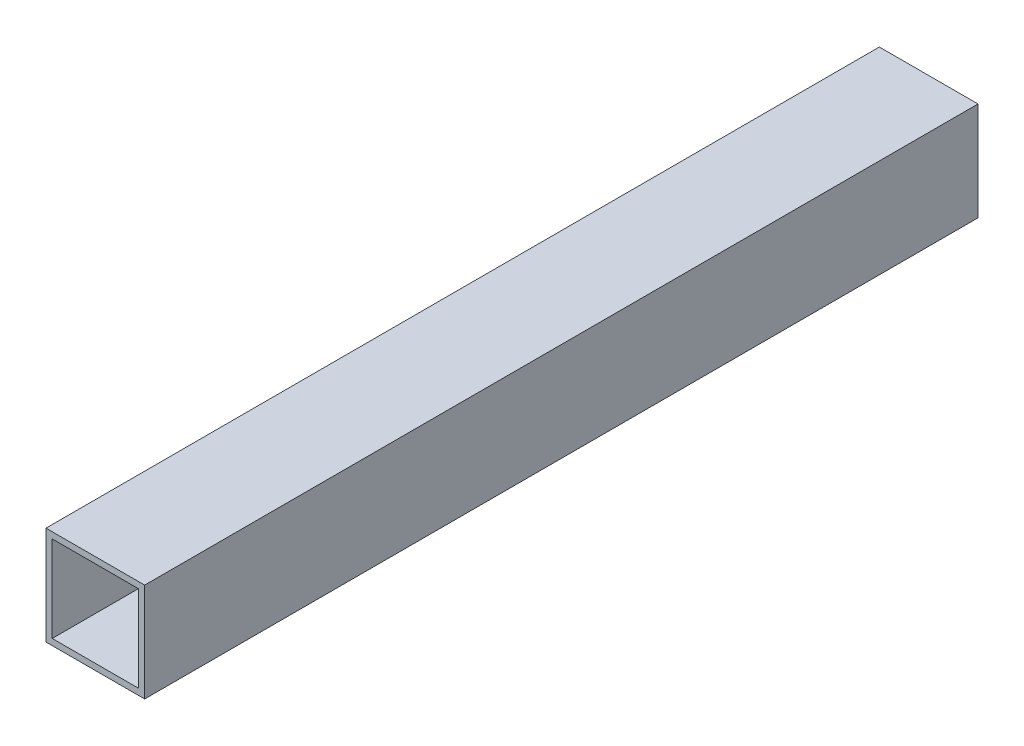
ISO-10303-21;
HEADER;
FILE_DESCRIPTION(('STEP AP214'),'2;1');
FILE_NAME('part.step','',(''),(''),'','','');
FILE_SCHEMA(('AUTOMOTIVE_DESIGN { 1 0 10303 214 1 1 1 1 }'));
ENDSEC;
DATA;
#1=APPLICATION_CONTEXT('core data for automotive mechanical design processes');
#2=APPLICATION_PROTOCOL_DEFINITION('international standard','automotive_design',2000,#1);
#3=PRODUCT_CONTEXT('',#1,'mechanical');
#4=PRODUCT('Part','Part','',(#3));
#5=PRODUCT_RELATED_PRODUCT_CATEGORY('part','',(#4));
#6=PRODUCT_DEFINITION_FORMATION('','',#4);
#7=PRODUCT_DEFINITION_CONTEXT('part definition',#1,'design');
#8=PRODUCT_DEFINITION('design','',#6,#7);
#9=PRODUCT_DEFINITION_SHAPE('','',#8);
#10=(LENGTH_UNIT() NAMED_UNIT(*) SI_UNIT(.MILLI.,.METRE.));
#11=(NAMED_UNIT(*) PLANE_ANGLE_UNIT() SI_UNIT($,.RADIAN.));
#12=(NAMED_UNIT(*) SI_UNIT($,.STERADIAN.) SOLID_ANGLE_UNIT());
#13=UNCERTAINTY_MEASURE_WITH_UNIT(LENGTH_MEASURE(1.E-05),#10,'distance_accuracy_value','');
#14=(GEOMETRIC_REPRESENTATION_CONTEXT(3) GLOBAL_UNCERTAINTY_ASSIGNED_CONTEXT((#13)) GLOBAL_UNIT_ASSIGNED_CONTEXT((#10,
#11,#12)) REPRESENTATION_CONTEXT('',''));
#15=CARTESIAN_POINT('',(0.,0.,0.));
#16=DIRECTION('',(0.,0.,1.));
#17=DIRECTION('',(1.,0.,0.));
#18=AXIS2_PLACEMENT_3D('',#15,#16,#17);
#19=CARTESIAN_POINT('',(0.,0.,80.25));
#20=DIRECTION('',(0.,0.,-1.));
#21=DIRECTION('',(-1.,0.,0.));
#22=AXIS2_PLACEMENT_3D('',#19,#20,#21);
#23=PLANE('',#22);
#24=DIRECTION('',(0.,-1.,0.));
#25=VECTOR('',#24,1.);
#26=CARTESIAN_POINT('',(-9.5,9.5,80.25));
#27=LINE('',#26,#25);
#28=CARTESIAN_POINT('',(-9.5,9.5,80.25));
#29=VERTEX_POINT('',#28);
#30=CARTESIAN_POINT('',(-9.5,-9.5,80.25));
#31=VERTEX_POINT('',#30);
#32=EDGE_CURVE('E138',#29,#31,#27,.T.);
#33=ORIENTED_EDGE('',*,*,#32,.T.);
#34=DIRECTION('',(1.,0.,0.));
#35=VECTOR('',#34,1.);
#36=CARTESIAN_POINT('',(9.5,-9.5,80.25));
#37=LINE('',#36,#35);
#38=CARTESIAN_POINT('',(9.5,-9.5,80.25));
#39=VERTEX_POINT('',#38);
#40=EDGE_CURVE('E141',#31,#39,#37,.T.);
#41=ORIENTED_EDGE('',*,*,#40,.T.);
#42=DIRECTION('',(0.,1.,0.));
#43=VECTOR('',#42,1.);
#44=CARTESIAN_POINT('',(9.5,9.5,80.25));
#45=LINE('',#44,#43);
#46=CARTESIAN_POINT('',(9.5,9.5,80.25));
#47=VERTEX_POINT('',#46);
#48=EDGE_CURVE('E144',#39,#47,#45,.T.);
#49=ORIENTED_EDGE('',*,*,#48,.T.);
#50=DIRECTION('',(-1.,0.,0.));
#51=VECTOR('',#50,1.);
#52=CARTESIAN_POINT('',(9.5,9.5,80.25));
#53=LINE('',#52,#51);
#54=EDGE_CURVE('E146',#47,#29,#53,.T.);
#55=ORIENTED_EDGE('',*,*,#54,.T.);
#56=EDGE_LOOP('',(#33,#41,#49,#55));
#57=FACE_BOUND('',#56,.T.);
#58=DIRECTION('',(-1.,0.,0.));
#59=VECTOR('',#58,1.);
#60=CARTESIAN_POINT('',(8.3,8.3,80.25));
#61=LINE('',#60,#59);
#62=CARTESIAN_POINT('',(8.3,8.3,80.25));
#63=VERTEX_POINT('',#62);
#64=CARTESIAN_POINT('',(-8.3,8.3,80.25));
#65=VERTEX_POINT('',#64);
#66=EDGE_CURVE('E102',#63,#65,#61,.T.);
#67=ORIENTED_EDGE('',*,*,#66,.F.);
#68=DIRECTION('',(0.,1.,0.));
#69=VECTOR('',#68,1.);
#70=CARTESIAN_POINT('',(8.3,8.3,80.25));
#71=LINE('',#70,#69);
#72=CARTESIAN_POINT('',(8.3,-8.3,80.25));
#73=VERTEX_POINT('',#72);
#74=EDGE_CURVE('E124',#73,#63,#71,.T.);
#75=ORIENTED_EDGE('',*,*,#74,.F.);
#76=DIRECTION('',(1.,0.,0.));
#77=VECTOR('',#76,1.);
#78=CARTESIAN_POINT('',(8.3,-8.3,80.25));
#79=LINE('',#78,#77);
#80=CARTESIAN_POINT('',(-8.3,-8.3,80.25));
#81=VERTEX_POINT('',#80);
#82=EDGE_CURVE('E122',#81,#73,#79,.T.);
#83=ORIENTED_EDGE('',*,*,#82,.F.);
#84=DIRECTION('',(0.,-1.,0.));
#85=VECTOR('',#84,1.);
#86=CARTESIAN_POINT('',(-8.3,8.3,80.25));
#87=LINE('',#86,#85);
#88=EDGE_CURVE('E110',#65,#81,#87,.T.);
#89=ORIENTED_EDGE('',*,*,#88,.F.);
#90=EDGE_LOOP('',(#67,#75,#83,#89));
#91=FACE_BOUND('',#90,.T.);
#92=ADVANCED_FACE('F37',(#57,#91),#23,.F.);
#93=CARTESIAN_POINT('',(0.,0.,-80.25));
#94=DIRECTION('',(0.,0.,-1.));
#95=DIRECTION('',(-1.,0.,0.));
#96=AXIS2_PLACEMENT_3D('',#93,#94,#95);
#97=PLANE('',#96);
#98=DIRECTION('',(0.,-1.,0.));
#99=VECTOR('',#98,1.);
#100=CARTESIAN_POINT('',(-9.5,9.5,-80.25));
#101=LINE('',#100,#99);
#102=CARTESIAN_POINT('',(-9.5,9.5,-80.25));
#103=VERTEX_POINT('',#102);
#104=CARTESIAN_POINT('',(-9.5,-9.5,-80.25));
#105=VERTEX_POINT('',#104);
#106=EDGE_CURVE('E118',#103,#105,#101,.T.);
#107=ORIENTED_EDGE('',*,*,#106,.F.);
#108=DIRECTION('',(-1.,0.,0.));
#109=VECTOR('',#108,1.);
#110=CARTESIAN_POINT('',(9.5,9.5,-80.25));
#111=LINE('',#110,#109);
#112=CARTESIAN_POINT('',(9.5,9.5,-80.25));
#113=VERTEX_POINT('',#112);
#114=EDGE_CURVE('E142',#113,#103,#111,.T.);
#115=ORIENTED_EDGE('',*,*,#114,.F.);
#116=DIRECTION('',(0.,1.,0.));
#117=VECTOR('',#116,1.);
#118=CARTESIAN_POINT('',(9.5,9.5,-80.25));
#119=LINE('',#118,#117);
#120=CARTESIAN_POINT('',(9.5,-9.5,-80.25));
#121=VERTEX_POINT('',#120);
#122=EDGE_CURVE('E153',#121,#113,#119,.T.);
#123=ORIENTED_EDGE('',*,*,#122,.F.);
#124=DIRECTION('',(1.,0.,0.));
#125=VECTOR('',#124,1.);
#126=CARTESIAN_POINT('',(9.5,-9.5,-80.25));
#127=LINE('',#126,#125);
#128=EDGE_CURVE('E151',#105,#121,#127,.T.);
#129=ORIENTED_EDGE('',*,*,#128,.F.);
#130=EDGE_LOOP('',(#107,#115,#123,#129));
#131=FACE_BOUND('',#130,.T.);
#132=DIRECTION('',(0.,1.,0.));
#133=VECTOR('',#132,1.);
#134=CARTESIAN_POINT('',(8.3,8.3,-80.25));
#135=LINE('',#134,#133);
#136=CARTESIAN_POINT('',(8.3,-8.3,-80.25));
#137=VERTEX_POINT('',#136);
#138=CARTESIAN_POINT('',(8.3,8.3,-80.25));
#139=VERTEX_POINT('',#138);
#140=EDGE_CURVE('E111',#137,#139,#135,.T.);
#141=ORIENTED_EDGE('',*,*,#140,.T.);
#142=DIRECTION('',(-1.,0.,0.));
#143=VECTOR('',#142,1.);
#144=CARTESIAN_POINT('',(8.3,8.3,-80.25));
#145=LINE('',#144,#143);
#146=CARTESIAN_POINT('',(-8.3,8.3,-80.25));
#147=VERTEX_POINT('',#146);
#148=EDGE_CURVE('E60',#139,#147,#145,.T.);
#149=ORIENTED_EDGE('',*,*,#148,.T.);
#150=DIRECTION('',(0.,-1.,0.));
#151=VECTOR('',#150,1.);
#152=CARTESIAN_POINT('',(-8.3,8.3,-80.25));
#153=LINE('',#152,#151);
#154=CARTESIAN_POINT('',(-8.3,-8.3,-80.25));
#155=VERTEX_POINT('',#154);
#156=EDGE_CURVE('E117',#147,#155,#153,.T.);
#157=ORIENTED_EDGE('',*,*,#156,.T.);
#158=DIRECTION('',(1.,0.,0.));
#159=VECTOR('',#158,1.);
#160=CARTESIAN_POINT('',(8.3,-8.3,-80.25));
#161=LINE('',#160,#159);
#162=EDGE_CURVE('E130',#155,#137,#161,.T.);
#163=ORIENTED_EDGE('',*,*,#162,.T.);
#164=EDGE_LOOP('',(#141,#149,#157,#163));
#165=FACE_BOUND('',#164,.T.);
#166=ADVANCED_FACE('F171',(#131,#165),#97,.T.);
#167=CARTESIAN_POINT('',(-9.5,9.5,80.25));
#168=DIRECTION('',(1.,0.,0.));
#169=DIRECTION('',(0.,1.,0.));
#170=AXIS2_PLACEMENT_3D('',#167,#168,#169);
#171=PLANE('',#170);
#172=ORIENTED_EDGE('',*,*,#106,.T.);
#173=DIRECTION('',(0.,0.,-1.));
#174=VECTOR('',#173,1.);
#175=CARTESIAN_POINT('',(-9.5,-9.5,80.25));
#176=LINE('',#175,#174);
#177=EDGE_CURVE('E11',#31,#105,#176,.T.);
#178=ORIENTED_EDGE('',*,*,#177,.F.);
#179=ORIENTED_EDGE('',*,*,#32,.F.);
#180=DIRECTION('',(0.,0.,-1.));
#181=VECTOR('',#180,1.);
#182=CARTESIAN_POINT('',(-9.5,9.5,80.25));
#183=LINE('',#182,#181);
#184=EDGE_CURVE('E148',#29,#103,#183,.T.);
#185=ORIENTED_EDGE('',*,*,#184,.T.);
#186=EDGE_LOOP('',(#172,#178,#179,#185));
#187=FACE_BOUND('',#186,.T.);
#188=ADVANCED_FACE('F39',(#187),#171,.F.);
#189=CARTESIAN_POINT('',(9.5,-9.5,80.25));
#190=DIRECTION('',(0.,1.,0.));
#191=DIRECTION('',(-1.,0.,0.));
#192=AXIS2_PLACEMENT_3D('',#189,#190,#191);
#193=PLANE('',#192);
#194=ORIENTED_EDGE('',*,*,#128,.T.);
#195=DIRECTION('',(0.,0.,-1.));
#196=VECTOR('',#195,1.);
#197=CARTESIAN_POINT('',(9.5,-9.5,80.25));
#198=LINE('',#197,#196);
#199=EDGE_CURVE('E45',#39,#121,#198,.T.);
#200=ORIENTED_EDGE('',*,*,#199,.F.);
#201=ORIENTED_EDGE('',*,*,#40,.F.);
#202=ORIENTED_EDGE('',*,*,#177,.T.);
#203=EDGE_LOOP('',(#194,#200,#201,#202));
#204=FACE_BOUND('',#203,.T.);
#205=ADVANCED_FACE('F181',(#204),#193,.F.);
#206=CARTESIAN_POINT('',(9.5,9.5,80.25));
#207=DIRECTION('',(-1.,0.,0.));
#208=DIRECTION('',(0.,-1.,0.));
#209=AXIS2_PLACEMENT_3D('',#206,#207,#208);
#210=PLANE('',#209);
#211=ORIENTED_EDGE('',*,*,#122,.T.);
#212=DIRECTION('',(0.,0.,-1.));
#213=VECTOR('',#212,1.);
#214=CARTESIAN_POINT('',(9.5,9.5,80.25));
#215=LINE('',#214,#213);
#216=EDGE_CURVE('E158',#47,#113,#215,.T.);
#217=ORIENTED_EDGE('',*,*,#216,.F.);
#218=ORIENTED_EDGE('',*,*,#48,.F.);
#219=ORIENTED_EDGE('',*,*,#199,.T.);
#220=EDGE_LOOP('',(#211,#217,#218,#219));
#221=FACE_BOUND('',#220,.T.);
#222=ADVANCED_FACE('F165',(#221),#210,.F.);
#223=CARTESIAN_POINT('',(9.5,9.5,80.25));
#224=DIRECTION('',(0.,-1.,0.));
#225=DIRECTION('',(1.,0.,0.));
#226=AXIS2_PLACEMENT_3D('',#223,#224,#225);
#227=PLANE('',#226);
#228=ORIENTED_EDGE('',*,*,#114,.T.);
#229=ORIENTED_EDGE('',*,*,#184,.F.);
#230=ORIENTED_EDGE('',*,*,#54,.F.);
#231=ORIENTED_EDGE('',*,*,#216,.T.);
#232=EDGE_LOOP('',(#228,#229,#230,#231));
#233=FACE_BOUND('',#232,.T.);
#234=ADVANCED_FACE('F175',(#233),#227,.F.);
#235=CARTESIAN_POINT('',(8.3,8.3,80.25));
#236=DIRECTION('',(0.,-1.,0.));
#237=DIRECTION('',(1.,0.,0.));
#238=AXIS2_PLACEMENT_3D('',#235,#236,#237);
#239=PLANE('',#238);
#240=ORIENTED_EDGE('',*,*,#148,.F.);
#241=DIRECTION('',(0.,0.,-1.));
#242=VECTOR('',#241,1.);
#243=CARTESIAN_POINT('',(8.3,8.3,80.25));
#244=LINE('',#243,#242);
#245=EDGE_CURVE('E106',#63,#139,#244,.T.);
#246=ORIENTED_EDGE('',*,*,#245,.F.);
#247=ORIENTED_EDGE('',*,*,#66,.T.);
#248=DIRECTION('',(0.,0.,-1.));
#249=VECTOR('',#248,1.);
#250=CARTESIAN_POINT('',(-8.3,8.3,80.25));
#251=LINE('',#250,#249);
#252=EDGE_CURVE('E105',#65,#147,#251,.T.);
#253=ORIENTED_EDGE('',*,*,#252,.T.);
#254=EDGE_LOOP('',(#240,#246,#247,#253));
#255=FACE_BOUND('',#254,.T.);
#256=ADVANCED_FACE('F104',(#255),#239,.T.);
#257=CARTESIAN_POINT('',(-8.3,8.3,80.25));
#258=DIRECTION('',(1.,0.,0.));
#259=DIRECTION('',(0.,1.,0.));
#260=AXIS2_PLACEMENT_3D('',#257,#258,#259);
#261=PLANE('',#260);
#262=ORIENTED_EDGE('',*,*,#156,.F.);
#263=ORIENTED_EDGE('',*,*,#252,.F.);
#264=ORIENTED_EDGE('',*,*,#88,.T.);
#265=DIRECTION('',(0.,0.,-1.));
#266=VECTOR('',#265,1.);
#267=CARTESIAN_POINT('',(-8.3,-8.3,80.25));
#268=LINE('',#267,#266);
#269=EDGE_CURVE('E119',#81,#155,#268,.T.);
#270=ORIENTED_EDGE('',*,*,#269,.T.);
#271=EDGE_LOOP('',(#262,#263,#264,#270));
#272=FACE_BOUND('',#271,.T.);
#273=ADVANCED_FACE('F114',(#272),#261,.T.);
#274=CARTESIAN_POINT('',(8.3,-8.3,80.25));
#275=DIRECTION('',(0.,1.,0.));
#276=DIRECTION('',(-1.,0.,0.));
#277=AXIS2_PLACEMENT_3D('',#274,#275,#276);
#278=PLANE('',#277);
#279=ORIENTED_EDGE('',*,*,#162,.F.);
#280=ORIENTED_EDGE('',*,*,#269,.F.);
#281=ORIENTED_EDGE('',*,*,#82,.T.);
#282=DIRECTION('',(0.,0.,-1.));
#283=VECTOR('',#282,1.);
#284=CARTESIAN_POINT('',(8.3,-8.3,80.25));
#285=LINE('',#284,#283);
#286=EDGE_CURVE('E52',#73,#137,#285,.T.);
#287=ORIENTED_EDGE('',*,*,#286,.T.);
#288=EDGE_LOOP('',(#279,#280,#281,#287));
#289=FACE_BOUND('',#288,.T.);
#290=ADVANCED_FACE('F204',(#289),#278,.T.);
#291=CARTESIAN_POINT('',(8.3,8.3,80.25));
#292=DIRECTION('',(-1.,0.,0.));
#293=DIRECTION('',(0.,-1.,0.));
#294=AXIS2_PLACEMENT_3D('',#291,#292,#293);
#295=PLANE('',#294);
#296=ORIENTED_EDGE('',*,*,#140,.F.);
#297=ORIENTED_EDGE('',*,*,#286,.F.);
#298=ORIENTED_EDGE('',*,*,#74,.T.);
#299=ORIENTED_EDGE('',*,*,#245,.T.);
#300=EDGE_LOOP('',(#296,#297,#298,#299));
#301=FACE_BOUND('',#300,.T.);
#302=ADVANCED_FACE('F208',(#301),#295,.T.);
#303=CLOSED_SHELL('',(#92,#166,#188,#205,#222,#234,#256,#273,#290,#302));
#304=MANIFOLD_SOLID_BREP('B2',#303);
#305=ADVANCED_BREP_SHAPE_REPRESENTATION('',(#18,#304),#14);
#306=SHAPE_DEFINITION_REPRESENTATION(#9,#305);
ENDSEC;
END-ISO-10303-21;
